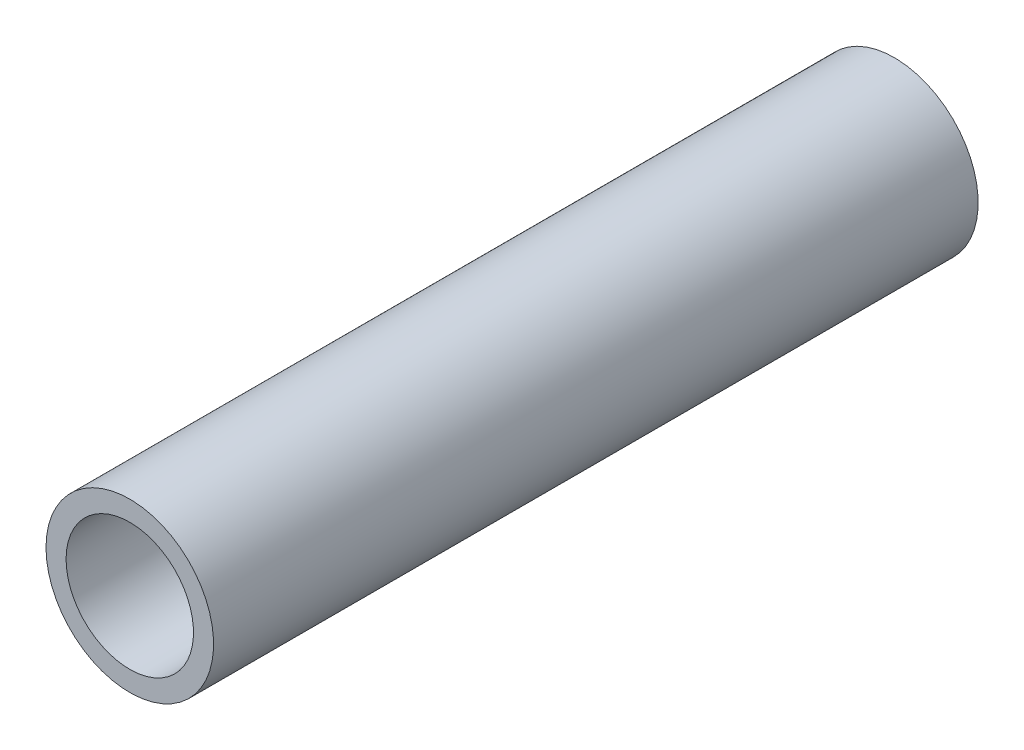
ISO-10303-21;
HEADER;
FILE_DESCRIPTION(('STEP AP214'),'2;1');
FILE_NAME('part.step','',(''),(''),'','','');
FILE_SCHEMA(('AUTOMOTIVE_DESIGN { 1 0 10303 214 1 1 1 1 }'));
ENDSEC;
DATA;
#1=APPLICATION_CONTEXT('core data for automotive mechanical design processes');
#2=APPLICATION_PROTOCOL_DEFINITION('international standard','automotive_design',2000,#1);
#3=PRODUCT_CONTEXT('',#1,'mechanical');
#4=PRODUCT('Part','Part','',(#3));
#5=PRODUCT_RELATED_PRODUCT_CATEGORY('part','',(#4));
#6=PRODUCT_DEFINITION_FORMATION('','',#4);
#7=PRODUCT_DEFINITION_CONTEXT('part definition',#1,'design');
#8=PRODUCT_DEFINITION('design','',#6,#7);
#9=PRODUCT_DEFINITION_SHAPE('','',#8);
#10=(LENGTH_UNIT() NAMED_UNIT(*) SI_UNIT(.MILLI.,.METRE.));
#11=(NAMED_UNIT(*) PLANE_ANGLE_UNIT() SI_UNIT($,.RADIAN.));
#12=(NAMED_UNIT(*) SI_UNIT($,.STERADIAN.) SOLID_ANGLE_UNIT());
#13=UNCERTAINTY_MEASURE_WITH_UNIT(LENGTH_MEASURE(1.E-05),#10,'distance_accuracy_value','');
#14=(GEOMETRIC_REPRESENTATION_CONTEXT(3) GLOBAL_UNCERTAINTY_ASSIGNED_CONTEXT((#13)) GLOBAL_UNIT_ASSIGNED_CONTEXT((#10,
#11,#12)) REPRESENTATION_CONTEXT('',''));
#15=CARTESIAN_POINT('',(0.,0.,0.));
#16=DIRECTION('',(0.,0.,1.));
#17=DIRECTION('',(1.,0.,0.));
#18=AXIS2_PLACEMENT_3D('',#15,#16,#17);
#19=CARTESIAN_POINT('',(0.,0.,152.4));
#20=DIRECTION('',(0.,0.,1.));
#21=DIRECTION('',(1.,0.,0.));
#22=AXIS2_PLACEMENT_3D('',#19,#20,#21);
#23=PLANE('',#22);
#24=CARTESIAN_POINT('',(0.,0.,152.4));
#25=DIRECTION('',(0.,0.,1.));
#26=DIRECTION('',(1.,0.,0.));
#27=AXIS2_PLACEMENT_3D('',#24,#25,#26);
#28=CIRCLE('',#27,16.7005);
#29=CARTESIAN_POINT('',(-16.7005,0.,152.4));
#30=VERTEX_POINT('',#29);
#31=EDGE_CURVE('E10',#30,#30,#28,.T.);
#32=ORIENTED_EDGE('',*,*,#31,.T.);
#33=EDGE_LOOP('',(#32));
#34=FACE_BOUND('',#33,.T.);
#35=CARTESIAN_POINT('',(0.,0.,152.4));
#36=DIRECTION('',(0.,0.,1.));
#37=DIRECTION('',(1.,0.,0.));
#38=AXIS2_PLACEMENT_3D('',#35,#36,#37);
#39=CIRCLE('',#38,12.7);
#40=CARTESIAN_POINT('',(-12.7,0.,152.4));
#41=VERTEX_POINT('',#40);
#42=EDGE_CURVE('E44',#41,#41,#39,.T.);
#43=ORIENTED_EDGE('',*,*,#42,.F.);
#44=EDGE_LOOP('',(#43));
#45=FACE_BOUND('',#44,.T.);
#46=ADVANCED_FACE('F33',(#34,#45),#23,.T.);
#47=CARTESIAN_POINT('',(0.,0.,0.));
#48=DIRECTION('',(0.,0.,1.));
#49=DIRECTION('',(1.,0.,0.));
#50=AXIS2_PLACEMENT_3D('',#47,#48,#49);
#51=PLANE('',#50);
#52=CARTESIAN_POINT('',(0.,0.,0.));
#53=DIRECTION('',(0.,0.,1.));
#54=DIRECTION('',(1.,0.,0.));
#55=AXIS2_PLACEMENT_3D('',#52,#53,#54);
#56=CIRCLE('',#55,16.7005);
#57=CARTESIAN_POINT('',(-16.7005,0.,0.));
#58=VERTEX_POINT('',#57);
#59=EDGE_CURVE('E37',#58,#58,#56,.T.);
#60=ORIENTED_EDGE('',*,*,#59,.F.);
#61=EDGE_LOOP('',(#60));
#62=FACE_BOUND('',#61,.T.);
#63=CARTESIAN_POINT('',(0.,0.,0.));
#64=DIRECTION('',(0.,0.,1.));
#65=DIRECTION('',(1.,0.,0.));
#66=AXIS2_PLACEMENT_3D('',#63,#64,#65);
#67=CIRCLE('',#66,12.7);
#68=CARTESIAN_POINT('',(-12.7,0.,0.));
#69=VERTEX_POINT('',#68);
#70=EDGE_CURVE('E46',#69,#69,#67,.T.);
#71=ORIENTED_EDGE('',*,*,#70,.T.);
#72=EDGE_LOOP('',(#71));
#73=FACE_BOUND('',#72,.T.);
#74=ADVANCED_FACE('F56',(#62,#73),#51,.F.);
#75=CARTESIAN_POINT('',(0.,0.,152.4));
#76=DIRECTION('',(0.,0.,-1.));
#77=DIRECTION('',(-1.,0.,0.));
#78=AXIS2_PLACEMENT_3D('',#75,#76,#77);
#79=CYLINDRICAL_SURFACE('',#78,16.7005);
#80=CARTESIAN_POINT('',(-16.7005,0.,152.4));
#81=CARTESIAN_POINT('',(-16.7005,0.,150.8125));
#82=CARTESIAN_POINT('',(-16.7005,0.,149.225));
#83=CARTESIAN_POINT('',(-16.7005,0.,146.05));
#84=CARTESIAN_POINT('',(-16.7005,0.,144.4625));
#85=CARTESIAN_POINT('',(-16.7005,0.,141.2875));
#86=CARTESIAN_POINT('',(-16.7005,0.,139.7));
#87=CARTESIAN_POINT('',(-16.7005,0.,136.525));
#88=CARTESIAN_POINT('',(-16.7005,0.,134.9375));
#89=CARTESIAN_POINT('',(-16.7005,0.,131.7625));
#90=CARTESIAN_POINT('',(-16.7005,0.,130.175));
#91=CARTESIAN_POINT('',(-16.7005,0.,127.));
#92=CARTESIAN_POINT('',(-16.7005,0.,125.4125));
#93=CARTESIAN_POINT('',(-16.7005,0.,122.2375));
#94=CARTESIAN_POINT('',(-16.7005,0.,120.65));
#95=CARTESIAN_POINT('',(-16.7005,0.,117.475));
#96=CARTESIAN_POINT('',(-16.7005,0.,115.8875));
#97=CARTESIAN_POINT('',(-16.7005,0.,112.7125));
#98=CARTESIAN_POINT('',(-16.7005,0.,111.125));
#99=CARTESIAN_POINT('',(-16.7005,0.,107.95));
#100=CARTESIAN_POINT('',(-16.7005,0.,106.3625));
#101=CARTESIAN_POINT('',(-16.7005,0.,103.1875));
#102=CARTESIAN_POINT('',(-16.7005,0.,101.6));
#103=CARTESIAN_POINT('',(-16.7005,0.,98.425));
#104=CARTESIAN_POINT('',(-16.7005,0.,96.8375));
#105=CARTESIAN_POINT('',(-16.7005,0.,93.6625));
#106=CARTESIAN_POINT('',(-16.7005,0.,92.075));
#107=CARTESIAN_POINT('',(-16.7005,0.,88.9));
#108=CARTESIAN_POINT('',(-16.7005,0.,87.3125));
#109=CARTESIAN_POINT('',(-16.7005,0.,84.1375));
#110=CARTESIAN_POINT('',(-16.7005,0.,82.55));
#111=CARTESIAN_POINT('',(-16.7005,0.,79.375));
#112=CARTESIAN_POINT('',(-16.7005,0.,77.7875));
#113=CARTESIAN_POINT('',(-16.7005,0.,74.6125));
#114=CARTESIAN_POINT('',(-16.7005,0.,73.025));
#115=CARTESIAN_POINT('',(-16.7005,0.,69.85));
#116=CARTESIAN_POINT('',(-16.7005,0.,68.2625));
#117=CARTESIAN_POINT('',(-16.7005,0.,65.0875));
#118=CARTESIAN_POINT('',(-16.7005,0.,63.5));
#119=CARTESIAN_POINT('',(-16.7005,0.,60.325));
#120=CARTESIAN_POINT('',(-16.7005,0.,58.7375));
#121=CARTESIAN_POINT('',(-16.7005,0.,55.5625));
#122=CARTESIAN_POINT('',(-16.7005,0.,53.975));
#123=CARTESIAN_POINT('',(-16.7005,0.,50.8));
#124=CARTESIAN_POINT('',(-16.7005,0.,49.2125));
#125=CARTESIAN_POINT('',(-16.7005,0.,46.0375));
#126=CARTESIAN_POINT('',(-16.7005,0.,44.45));
#127=CARTESIAN_POINT('',(-16.7005,0.,41.275));
#128=CARTESIAN_POINT('',(-16.7005,0.,39.6875));
#129=CARTESIAN_POINT('',(-16.7005,0.,36.5125));
#130=CARTESIAN_POINT('',(-16.7005,0.,34.925));
#131=CARTESIAN_POINT('',(-16.7005,0.,31.75));
#132=CARTESIAN_POINT('',(-16.7005,0.,30.1625));
#133=CARTESIAN_POINT('',(-16.7005,0.,26.9875));
#134=CARTESIAN_POINT('',(-16.7005,0.,25.4));
#135=CARTESIAN_POINT('',(-16.7005,0.,22.225));
#136=CARTESIAN_POINT('',(-16.7005,0.,20.6375));
#137=CARTESIAN_POINT('',(-16.7005,0.,17.4625));
#138=CARTESIAN_POINT('',(-16.7005,0.,15.875));
#139=CARTESIAN_POINT('',(-16.7005,0.,12.7));
#140=CARTESIAN_POINT('',(-16.7005,0.,11.1125));
#141=CARTESIAN_POINT('',(-16.7005,0.,7.93750000000001));
#142=CARTESIAN_POINT('',(-16.7005,0.,6.35));
#143=CARTESIAN_POINT('',(-16.7005,0.,3.175));
#144=CARTESIAN_POINT('',(-16.7005,0.,1.5875));
#145=CARTESIAN_POINT('',(-16.7005,0.,0.));
#146=B_SPLINE_CURVE_WITH_KNOTS('',3,(#80,#81,#82,#83,#84,#85,#86,#87,#88,#89,#90,#91,#92,#93,
#94,#95,#96,#97,#98,#99,#100,#101,#102,#103,#104,#105,#106,#107,#108,#109,#110,#111,#112,#113,
#114,#115,#116,#117,#118,#119,#120,#121,#122,#123,#124,#125,#126,#127,#128,#129,#130,#131,#132,
#133,#134,#135,#136,#137,#138,#139,#140,#141,#142,#143,#144,#145),.UNSPECIFIED.,.F.,.F.,(4,2,2,
2,2,2,2,2,2,2,2,2,2,2,2,2,2,2,2,2,2,2,2,2,2,2,2,2,2,2,2,2,4),(0.,4.7625,9.52500000000001,
14.2875,19.05,23.8125,28.575,33.3375,38.1,42.8625,47.625,52.3875,57.15,61.9125,66.675,71.4375,
76.2,80.9625,85.725,90.4875,95.25,100.0125,104.775,109.5375,114.3,119.0625,123.825,128.5875,
133.35,138.1125,142.875,147.6375,152.4),.UNSPECIFIED.);
#147=EDGE_CURVE('BSEAM35',#30,#58,#146,.T.);
#148=ORIENTED_EDGE('',*,*,#31,.F.);
#149=ORIENTED_EDGE('',*,*,#59,.T.);
#150=ORIENTED_EDGE('',*,*,#147,.T.);
#151=ORIENTED_EDGE('',*,*,#147,.F.);
#152=EDGE_LOOP('',(#148,#150,#149,#151));
#153=FACE_BOUND('',#152,.T.);
#154=ADVANCED_FACE('F35',(#153),#79,.T.);
#155=CARTESIAN_POINT('',(0.,0.,152.4));
#156=DIRECTION('',(0.,0.,-1.));
#157=DIRECTION('',(-1.,0.,0.));
#158=AXIS2_PLACEMENT_3D('',#155,#156,#157);
#159=CYLINDRICAL_SURFACE('',#158,12.7);
#160=CARTESIAN_POINT('',(-12.7,0.,152.4));
#161=CARTESIAN_POINT('',(-12.7,0.,150.8125));
#162=CARTESIAN_POINT('',(-12.7,0.,149.225));
#163=CARTESIAN_POINT('',(-12.7,0.,146.05));
#164=CARTESIAN_POINT('',(-12.7,0.,144.4625));
#165=CARTESIAN_POINT('',(-12.7,0.,141.2875));
#166=CARTESIAN_POINT('',(-12.7,0.,139.7));
#167=CARTESIAN_POINT('',(-12.7,0.,136.525));
#168=CARTESIAN_POINT('',(-12.7,0.,134.9375));
#169=CARTESIAN_POINT('',(-12.7,0.,131.7625));
#170=CARTESIAN_POINT('',(-12.7,0.,130.175));
#171=CARTESIAN_POINT('',(-12.7,0.,127.));
#172=CARTESIAN_POINT('',(-12.7,0.,125.4125));
#173=CARTESIAN_POINT('',(-12.7,0.,122.2375));
#174=CARTESIAN_POINT('',(-12.7,0.,120.65));
#175=CARTESIAN_POINT('',(-12.7,0.,117.475));
#176=CARTESIAN_POINT('',(-12.7,0.,115.8875));
#177=CARTESIAN_POINT('',(-12.7,0.,112.7125));
#178=CARTESIAN_POINT('',(-12.7,0.,111.125));
#179=CARTESIAN_POINT('',(-12.7,0.,107.95));
#180=CARTESIAN_POINT('',(-12.7,0.,106.3625));
#181=CARTESIAN_POINT('',(-12.7,0.,103.1875));
#182=CARTESIAN_POINT('',(-12.7,0.,101.6));
#183=CARTESIAN_POINT('',(-12.7,0.,98.425));
#184=CARTESIAN_POINT('',(-12.7,0.,96.8375));
#185=CARTESIAN_POINT('',(-12.7,0.,93.6625));
#186=CARTESIAN_POINT('',(-12.7,0.,92.075));
#187=CARTESIAN_POINT('',(-12.7,0.,88.9));
#188=CARTESIAN_POINT('',(-12.7,0.,87.3125));
#189=CARTESIAN_POINT('',(-12.7,0.,84.1375));
#190=CARTESIAN_POINT('',(-12.7,0.,82.55));
#191=CARTESIAN_POINT('',(-12.7,0.,79.375));
#192=CARTESIAN_POINT('',(-12.7,0.,77.7875));
#193=CARTESIAN_POINT('',(-12.7,0.,74.6125));
#194=CARTESIAN_POINT('',(-12.7,0.,73.025));
#195=CARTESIAN_POINT('',(-12.7,0.,69.85));
#196=CARTESIAN_POINT('',(-12.7,0.,68.2625));
#197=CARTESIAN_POINT('',(-12.7,0.,65.0875));
#198=CARTESIAN_POINT('',(-12.7,0.,63.5));
#199=CARTESIAN_POINT('',(-12.7,0.,60.325));
#200=CARTESIAN_POINT('',(-12.7,0.,58.7375));
#201=CARTESIAN_POINT('',(-12.7,0.,55.5625));
#202=CARTESIAN_POINT('',(-12.7,0.,53.975));
#203=CARTESIAN_POINT('',(-12.7,0.,50.8));
#204=CARTESIAN_POINT('',(-12.7,0.,49.2125));
#205=CARTESIAN_POINT('',(-12.7,0.,46.0375));
#206=CARTESIAN_POINT('',(-12.7,0.,44.45));
#207=CARTESIAN_POINT('',(-12.7,0.,41.275));
#208=CARTESIAN_POINT('',(-12.7,0.,39.6875));
#209=CARTESIAN_POINT('',(-12.7,0.,36.5125));
#210=CARTESIAN_POINT('',(-12.7,0.,34.925));
#211=CARTESIAN_POINT('',(-12.7,0.,31.75));
#212=CARTESIAN_POINT('',(-12.7,0.,30.1625));
#213=CARTESIAN_POINT('',(-12.7,0.,26.9875));
#214=CARTESIAN_POINT('',(-12.7,0.,25.4));
#215=CARTESIAN_POINT('',(-12.7,0.,22.225));
#216=CARTESIAN_POINT('',(-12.7,0.,20.6375));
#217=CARTESIAN_POINT('',(-12.7,0.,17.4625));
#218=CARTESIAN_POINT('',(-12.7,0.,15.875));
#219=CARTESIAN_POINT('',(-12.7,0.,12.7));
#220=CARTESIAN_POINT('',(-12.7,0.,11.1125));
#221=CARTESIAN_POINT('',(-12.7,0.,7.93750000000001));
#222=CARTESIAN_POINT('',(-12.7,0.,6.35));
#223=CARTESIAN_POINT('',(-12.7,0.,3.175));
#224=CARTESIAN_POINT('',(-12.7,0.,1.5875));
#225=CARTESIAN_POINT('',(-12.7,0.,0.));
#226=B_SPLINE_CURVE_WITH_KNOTS('',3,(#160,#161,#162,#163,#164,#165,#166,#167,#168,#169,#170,
#171,#172,#173,#174,#175,#176,#177,#178,#179,#180,#181,#182,#183,#184,#185,#186,#187,#188,#189,
#190,#191,#192,#193,#194,#195,#196,#197,#198,#199,#200,#201,#202,#203,#204,#205,#206,#207,#208,
#209,#210,#211,#212,#213,#214,#215,#216,#217,#218,#219,#220,#221,#222,#223,#224,#225),
.UNSPECIFIED.,.F.,.F.,(4,2,2,2,2,2,2,2,2,2,2,2,2,2,2,2,2,2,2,2,2,2,2,2,2,2,2,2,2,2,2,2,4),(0.,
4.76249999999998,9.52499999999998,14.2875,19.05,23.8125,28.575,33.3375,38.1,42.8625,47.625,
52.3875,57.15,61.9125,66.675,71.4375,76.2,80.9625,85.725,90.4875,95.25,100.0125,104.775,
109.5375,114.3,119.0625,123.825,128.5875,133.35,138.1125,142.875,147.6375,152.4),.UNSPECIFIED.);
#227=EDGE_CURVE('BSEAM52',#41,#69,#226,.T.);
#228=ORIENTED_EDGE('',*,*,#42,.T.);
#229=ORIENTED_EDGE('',*,*,#70,.F.);
#230=ORIENTED_EDGE('',*,*,#227,.T.);
#231=ORIENTED_EDGE('',*,*,#227,.F.);
#232=EDGE_LOOP('',(#228,#230,#229,#231));
#233=FACE_BOUND('',#232,.T.);
#234=ADVANCED_FACE('F52',(#233),#159,.F.);
#235=CLOSED_SHELL('',(#46,#74,#154,#234));
#236=MANIFOLD_SOLID_BREP('B2',#235);
#237=ADVANCED_BREP_SHAPE_REPRESENTATION('',(#18,#236),#14);
#238=SHAPE_DEFINITION_REPRESENTATION(#9,#237);
ENDSEC;
END-ISO-10303-21;
